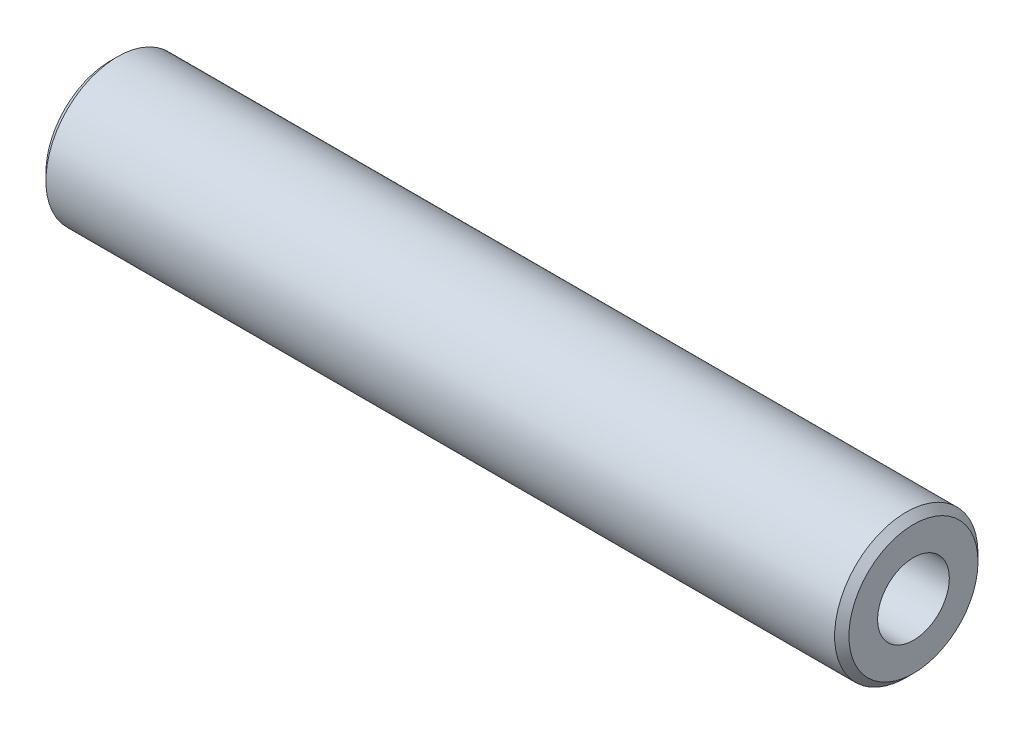
ISO-10303-21;
HEADER;
FILE_DESCRIPTION(('STEP AP214'),'2;1');
FILE_NAME('part.step','',(''),(''),'','','');
FILE_SCHEMA(('AUTOMOTIVE_DESIGN { 1 0 10303 214 1 1 1 1 }'));
ENDSEC;
DATA;
#1=APPLICATION_CONTEXT('core data for automotive mechanical design processes');
#2=APPLICATION_PROTOCOL_DEFINITION('international standard','automotive_design',2000,#1);
#3=PRODUCT_CONTEXT('',#1,'mechanical');
#4=PRODUCT('Part','Part','',(#3));
#5=PRODUCT_RELATED_PRODUCT_CATEGORY('part','',(#4));
#6=PRODUCT_DEFINITION_FORMATION('','',#4);
#7=PRODUCT_DEFINITION_CONTEXT('part definition',#1,'design');
#8=PRODUCT_DEFINITION('design','',#6,#7);
#9=PRODUCT_DEFINITION_SHAPE('','',#8);
#10=(LENGTH_UNIT() NAMED_UNIT(*) SI_UNIT(.MILLI.,.METRE.));
#11=(NAMED_UNIT(*) PLANE_ANGLE_UNIT() SI_UNIT($,.RADIAN.));
#12=(NAMED_UNIT(*) SI_UNIT($,.STERADIAN.) SOLID_ANGLE_UNIT());
#13=UNCERTAINTY_MEASURE_WITH_UNIT(LENGTH_MEASURE(1.E-05),#10,'distance_accuracy_value','');
#14=(GEOMETRIC_REPRESENTATION_CONTEXT(3) GLOBAL_UNCERTAINTY_ASSIGNED_CONTEXT((#13)) GLOBAL_UNIT_ASSIGNED_CONTEXT((#10,
#11,#12)) REPRESENTATION_CONTEXT('',''));
#15=CARTESIAN_POINT('',(0.,0.,0.));
#16=DIRECTION('',(0.,0.,1.));
#17=DIRECTION('',(1.,0.,0.));
#18=AXIS2_PLACEMENT_3D('',#15,#16,#17);
#19=CARTESIAN_POINT('',(28.,0.,0.));
#20=DIRECTION('',(1.,0.,0.));
#21=DIRECTION('',(0.,0.,-1.));
#22=AXIS2_PLACEMENT_3D('',#19,#20,#21);
#23=PLANE('',#22);
#24=CARTESIAN_POINT('',(28.,0.,0.));
#25=DIRECTION('',(1.,0.,0.));
#26=DIRECTION('',(0.,0.,-1.));
#27=AXIS2_PLACEMENT_3D('',#24,#25,#26);
#28=CIRCLE('',#27,4.49999999999999);
#29=CARTESIAN_POINT('',(28.,0.,-4.49999999999999));
#30=VERTEX_POINT('',#29);
#31=EDGE_CURVE('E59',#30,#30,#28,.T.);
#32=ORIENTED_EDGE('',*,*,#31,.T.);
#33=EDGE_LOOP('',(#32));
#34=FACE_BOUND('',#33,.T.);
#35=CARTESIAN_POINT('',(28.,0.,0.));
#36=DIRECTION('',(1.,0.,0.));
#37=DIRECTION('',(0.,0.,-1.));
#38=AXIS2_PLACEMENT_3D('',#35,#36,#37);
#39=CIRCLE('',#38,2.5);
#40=CARTESIAN_POINT('',(28.,0.,-2.5));
#41=VERTEX_POINT('',#40);
#42=EDGE_CURVE('E65',#41,#41,#39,.T.);
#43=ORIENTED_EDGE('',*,*,#42,.F.);
#44=EDGE_LOOP('',(#43));
#45=FACE_BOUND('',#44,.T.);
#46=ADVANCED_FACE('F40',(#34,#45),#23,.T.);
#47=CARTESIAN_POINT('',(-28.,0.,0.));
#48=DIRECTION('',(1.,0.,0.));
#49=DIRECTION('',(0.,0.,-1.));
#50=AXIS2_PLACEMENT_3D('',#47,#48,#49);
#51=PLANE('',#50);
#52=CARTESIAN_POINT('',(-28.,0.,0.));
#53=DIRECTION('',(1.,0.,0.));
#54=DIRECTION('',(0.,0.,-1.));
#55=AXIS2_PLACEMENT_3D('',#52,#53,#54);
#56=CIRCLE('',#55,4.49999999999998);
#57=CARTESIAN_POINT('',(-28.,0.,-4.49999999999998));
#58=VERTEX_POINT('',#57);
#59=EDGE_CURVE('E10',#58,#58,#56,.F.);
#60=ORIENTED_EDGE('',*,*,#59,.T.);
#61=EDGE_LOOP('',(#60));
#62=FACE_BOUND('',#61,.T.);
#63=CARTESIAN_POINT('',(-28.,0.,0.));
#64=DIRECTION('',(1.,0.,0.));
#65=DIRECTION('',(0.,0.,-1.));
#66=AXIS2_PLACEMENT_3D('',#63,#64,#65);
#67=CIRCLE('',#66,2.5);
#68=CARTESIAN_POINT('',(-28.,0.,-2.5));
#69=VERTEX_POINT('',#68);
#70=EDGE_CURVE('E66',#69,#69,#67,.T.);
#71=ORIENTED_EDGE('',*,*,#70,.T.);
#72=EDGE_LOOP('',(#71));
#73=FACE_BOUND('',#72,.T.);
#74=ADVANCED_FACE('F78',(#62,#73),#51,.F.);
#75=CARTESIAN_POINT('',(28.,0.,0.));
#76=DIRECTION('',(-1.,0.,0.));
#77=DIRECTION('',(0.,0.,1.));
#78=AXIS2_PLACEMENT_3D('',#75,#76,#77);
#79=CYLINDRICAL_SURFACE('',#78,5.);
#80=CARTESIAN_POINT('',(27.5,0.,0.));
#81=DIRECTION('',(1.,0.,0.));
#82=DIRECTION('',(0.,0.,-1.));
#83=AXIS2_PLACEMENT_3D('',#80,#81,#82);
#84=CIRCLE('',#83,5.);
#85=CARTESIAN_POINT('',(27.5,0.,-5.));
#86=VERTEX_POINT('',#85);
#87=EDGE_CURVE('E49',#86,#86,#84,.F.);
#88=ORIENTED_EDGE('',*,*,#87,.T.);
#89=EDGE_LOOP('',(#88));
#90=FACE_BOUND('',#89,.T.);
#91=CARTESIAN_POINT('',(-27.5,0.,0.));
#92=DIRECTION('',(1.,0.,0.));
#93=DIRECTION('',(0.,0.,-1.));
#94=AXIS2_PLACEMENT_3D('',#91,#92,#93);
#95=CIRCLE('',#94,5.);
#96=CARTESIAN_POINT('',(-27.5,0.,-5.));
#97=VERTEX_POINT('',#96);
#98=EDGE_CURVE('E54',#97,#97,#95,.T.);
#99=ORIENTED_EDGE('',*,*,#98,.T.);
#100=EDGE_LOOP('',(#99));
#101=FACE_BOUND('',#100,.T.);
#102=ADVANCED_FACE('F84',(#90,#101),#79,.T.);
#103=CARTESIAN_POINT('',(28.,0.,0.));
#104=DIRECTION('',(-1.,0.,0.));
#105=DIRECTION('',(0.,0.,1.));
#106=AXIS2_PLACEMENT_3D('',#103,#104,#105);
#107=CYLINDRICAL_SURFACE('',#106,2.5);
#108=ORIENTED_EDGE('',*,*,#42,.T.);
#109=EDGE_LOOP('',(#108));
#110=FACE_BOUND('',#109,.T.);
#111=ORIENTED_EDGE('',*,*,#70,.F.);
#112=EDGE_LOOP('',(#111));
#113=FACE_BOUND('',#112,.T.);
#114=ADVANCED_FACE('F74',(#110,#113),#107,.F.);
#115=CARTESIAN_POINT('',(28.,0.,0.));
#116=DIRECTION('',(-1.,0.,0.));
#117=DIRECTION('',(0.,0.,1.));
#118=AXIS2_PLACEMENT_3D('',#115,#116,#117);
#119=CONICAL_SURFACE('',#118,4.49999999999999,0.785398163397454);
#120=ORIENTED_EDGE('',*,*,#87,.F.);
#121=EDGE_LOOP('',(#120));
#122=FACE_BOUND('',#121,.T.);
#123=ORIENTED_EDGE('',*,*,#31,.F.);
#124=EDGE_LOOP('',(#123));
#125=FACE_BOUND('',#124,.T.);
#126=ADVANCED_FACE('F90',(#122,#125),#119,.T.);
#127=CARTESIAN_POINT('',(-27.5,0.,0.));
#128=DIRECTION('',(1.,0.,0.));
#129=DIRECTION('',(0.,0.,-1.));
#130=AXIS2_PLACEMENT_3D('',#127,#128,#129);
#131=CONICAL_SURFACE('',#130,5.,0.785398163397451);
#132=ORIENTED_EDGE('',*,*,#59,.F.);
#133=EDGE_LOOP('',(#132));
#134=FACE_BOUND('',#133,.T.);
#135=ORIENTED_EDGE('',*,*,#98,.F.);
#136=EDGE_LOOP('',(#135));
#137=FACE_BOUND('',#136,.T.);
#138=ADVANCED_FACE('F43',(#134,#137),#131,.T.);
#139=CLOSED_SHELL('',(#46,#74,#102,#114,#126,#138));
#140=MANIFOLD_SOLID_BREP('B2',#139);
#141=ADVANCED_BREP_SHAPE_REPRESENTATION('',(#18,#140),#14);
#142=SHAPE_DEFINITION_REPRESENTATION(#9,#141);
ENDSEC;
END-ISO-10303-21;
